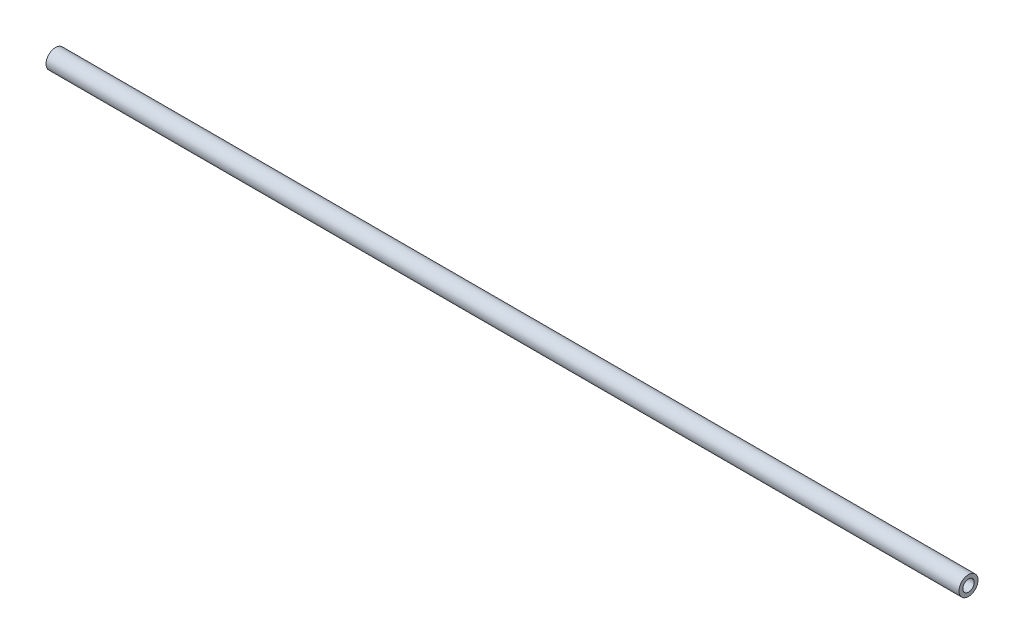
ISO-10303-21;
HEADER;
FILE_DESCRIPTION(('STEP AP214'),'2;1');
FILE_NAME('part.step','',(''),(''),'','','');
FILE_SCHEMA(('AUTOMOTIVE_DESIGN { 1 0 10303 214 1 1 1 1 }'));
ENDSEC;
DATA;
#1=APPLICATION_CONTEXT('core data for automotive mechanical design processes');
#2=APPLICATION_PROTOCOL_DEFINITION('international standard','automotive_design',2000,#1);
#3=PRODUCT_CONTEXT('',#1,'mechanical');
#4=PRODUCT('Part','Part','',(#3));
#5=PRODUCT_RELATED_PRODUCT_CATEGORY('part','',(#4));
#6=PRODUCT_DEFINITION_FORMATION('','',#4);
#7=PRODUCT_DEFINITION_CONTEXT('part definition',#1,'design');
#8=PRODUCT_DEFINITION('design','',#6,#7);
#9=PRODUCT_DEFINITION_SHAPE('','',#8);
#10=(LENGTH_UNIT() NAMED_UNIT(*) SI_UNIT(.MILLI.,.METRE.));
#11=(NAMED_UNIT(*) PLANE_ANGLE_UNIT() SI_UNIT($,.RADIAN.));
#12=(NAMED_UNIT(*) SI_UNIT($,.STERADIAN.) SOLID_ANGLE_UNIT());
#13=UNCERTAINTY_MEASURE_WITH_UNIT(LENGTH_MEASURE(1.E-05),#10,'distance_accuracy_value','');
#14=(GEOMETRIC_REPRESENTATION_CONTEXT(3) GLOBAL_UNCERTAINTY_ASSIGNED_CONTEXT((#13)) GLOBAL_UNIT_ASSIGNED_CONTEXT((#10,
#11,#12)) REPRESENTATION_CONTEXT('',''));
#15=CARTESIAN_POINT('',(0.,0.,0.));
#16=DIRECTION('',(0.,0.,1.));
#17=DIRECTION('',(1.,0.,0.));
#18=AXIS2_PLACEMENT_3D('',#15,#16,#17);
#19=CARTESIAN_POINT('',(152.4,0.,0.));
#20=DIRECTION('',(1.,0.,0.));
#21=DIRECTION('',(0.,0.,-1.));
#22=AXIS2_PLACEMENT_3D('',#19,#20,#21);
#23=PLANE('',#22);
#24=CARTESIAN_POINT('',(152.4,0.,0.));
#25=DIRECTION('',(1.,0.,0.));
#26=DIRECTION('',(0.,0.,-1.));
#27=AXIS2_PLACEMENT_3D('',#24,#25,#26);
#28=CIRCLE('',#27,3.175);
#29=CARTESIAN_POINT('',(152.4,0.,3.175));
#30=VERTEX_POINT('',#29);
#31=EDGE_CURVE('E10',#30,#30,#28,.T.);
#32=ORIENTED_EDGE('',*,*,#31,.T.);
#33=EDGE_LOOP('',(#32));
#34=FACE_BOUND('',#33,.T.);
#35=CARTESIAN_POINT('',(152.4,0.,0.));
#36=DIRECTION('',(1.,0.,0.));
#37=DIRECTION('',(0.,0.,-1.));
#38=AXIS2_PLACEMENT_3D('',#35,#36,#37);
#39=CIRCLE('',#38,1.905);
#40=CARTESIAN_POINT('',(152.4,0.,1.905));
#41=VERTEX_POINT('',#40);
#42=EDGE_CURVE('E41',#41,#41,#39,.T.);
#43=ORIENTED_EDGE('',*,*,#42,.F.);
#44=EDGE_LOOP('',(#43));
#45=FACE_BOUND('',#44,.T.);
#46=ADVANCED_FACE('F30',(#34,#45),#23,.T.);
#47=CARTESIAN_POINT('',(-152.4,0.,0.));
#48=DIRECTION('',(1.,0.,0.));
#49=DIRECTION('',(0.,0.,-1.));
#50=AXIS2_PLACEMENT_3D('',#47,#48,#49);
#51=PLANE('',#50);
#52=CARTESIAN_POINT('',(-152.4,0.,0.));
#53=DIRECTION('',(1.,0.,0.));
#54=DIRECTION('',(0.,0.,-1.));
#55=AXIS2_PLACEMENT_3D('',#52,#53,#54);
#56=CIRCLE('',#55,3.175);
#57=CARTESIAN_POINT('',(-152.4,0.,3.175));
#58=VERTEX_POINT('',#57);
#59=EDGE_CURVE('E34',#58,#58,#56,.T.);
#60=ORIENTED_EDGE('',*,*,#59,.F.);
#61=EDGE_LOOP('',(#60));
#62=FACE_BOUND('',#61,.T.);
#63=CARTESIAN_POINT('',(-152.4,0.,0.));
#64=DIRECTION('',(1.,0.,0.));
#65=DIRECTION('',(0.,0.,-1.));
#66=AXIS2_PLACEMENT_3D('',#63,#64,#65);
#67=CIRCLE('',#66,1.905);
#68=CARTESIAN_POINT('',(-152.4,0.,1.905));
#69=VERTEX_POINT('',#68);
#70=EDGE_CURVE('E43',#69,#69,#67,.T.);
#71=ORIENTED_EDGE('',*,*,#70,.T.);
#72=EDGE_LOOP('',(#71));
#73=FACE_BOUND('',#72,.T.);
#74=ADVANCED_FACE('F53',(#62,#73),#51,.F.);
#75=CARTESIAN_POINT('',(152.4,0.,0.));
#76=DIRECTION('',(-1.,0.,0.));
#77=DIRECTION('',(0.,0.,1.));
#78=AXIS2_PLACEMENT_3D('',#75,#76,#77);
#79=CYLINDRICAL_SURFACE('',#78,3.175);
#80=CARTESIAN_POINT('',(152.4,0.,3.175));
#81=CARTESIAN_POINT('',(149.225,0.,3.175));
#82=CARTESIAN_POINT('',(146.05,0.,3.175));
#83=CARTESIAN_POINT('',(139.7,0.,3.175));
#84=CARTESIAN_POINT('',(136.525,0.,3.175));
#85=CARTESIAN_POINT('',(130.175,0.,3.175));
#86=CARTESIAN_POINT('',(127.,0.,3.175));
#87=CARTESIAN_POINT('',(120.65,0.,3.175));
#88=CARTESIAN_POINT('',(117.475,0.,3.175));
#89=CARTESIAN_POINT('',(111.125,0.,3.175));
#90=CARTESIAN_POINT('',(107.95,0.,3.175));
#91=CARTESIAN_POINT('',(101.6,0.,3.175));
#92=CARTESIAN_POINT('',(98.425,0.,3.175));
#93=CARTESIAN_POINT('',(92.075,0.,3.175));
#94=CARTESIAN_POINT('',(88.9,0.,3.175));
#95=CARTESIAN_POINT('',(82.55,0.,3.175));
#96=CARTESIAN_POINT('',(79.375,0.,3.175));
#97=CARTESIAN_POINT('',(73.025,0.,3.175));
#98=CARTESIAN_POINT('',(69.85,0.,3.175));
#99=CARTESIAN_POINT('',(63.5,0.,3.175));
#100=CARTESIAN_POINT('',(60.325,0.,3.175));
#101=CARTESIAN_POINT('',(53.975,0.,3.175));
#102=CARTESIAN_POINT('',(50.8,0.,3.175));
#103=CARTESIAN_POINT('',(44.45,0.,3.175));
#104=CARTESIAN_POINT('',(41.275,0.,3.175));
#105=CARTESIAN_POINT('',(34.925,0.,3.175));
#106=CARTESIAN_POINT('',(31.75,0.,3.175));
#107=CARTESIAN_POINT('',(25.4,0.,3.175));
#108=CARTESIAN_POINT('',(22.225,0.,3.175));
#109=CARTESIAN_POINT('',(15.875,0.,3.175));
#110=CARTESIAN_POINT('',(12.7,0.,3.175));
#111=CARTESIAN_POINT('',(6.34999999999998,0.,3.175));
#112=CARTESIAN_POINT('',(3.17499999999997,0.,3.175));
#113=CARTESIAN_POINT('',(-3.17500000000003,0.,3.175));
#114=CARTESIAN_POINT('',(-6.35000000000003,0.,3.175));
#115=CARTESIAN_POINT('',(-12.7,0.,3.175));
#116=CARTESIAN_POINT('',(-15.875,0.,3.175));
#117=CARTESIAN_POINT('',(-22.225,0.,3.175));
#118=CARTESIAN_POINT('',(-25.4,0.,3.175));
#119=CARTESIAN_POINT('',(-31.75,0.,3.175));
#120=CARTESIAN_POINT('',(-34.925,0.,3.175));
#121=CARTESIAN_POINT('',(-41.275,0.,3.175));
#122=CARTESIAN_POINT('',(-44.45,0.,3.175));
#123=CARTESIAN_POINT('',(-50.8,0.,3.175));
#124=CARTESIAN_POINT('',(-53.975,0.,3.175));
#125=CARTESIAN_POINT('',(-60.325,0.,3.175));
#126=CARTESIAN_POINT('',(-63.5,0.,3.175));
#127=CARTESIAN_POINT('',(-69.85,0.,3.175));
#128=CARTESIAN_POINT('',(-73.025,0.,3.175));
#129=CARTESIAN_POINT('',(-79.375,0.,3.175));
#130=CARTESIAN_POINT('',(-82.5500000000001,0.,3.175));
#131=CARTESIAN_POINT('',(-88.9,0.,3.175));
#132=CARTESIAN_POINT('',(-92.0750000000001,0.,3.175));
#133=CARTESIAN_POINT('',(-98.425,0.,3.175));
#134=CARTESIAN_POINT('',(-101.6,0.,3.175));
#135=CARTESIAN_POINT('',(-107.95,0.,3.175));
#136=CARTESIAN_POINT('',(-111.125,0.,3.175));
#137=CARTESIAN_POINT('',(-117.475,0.,3.175));
#138=CARTESIAN_POINT('',(-120.65,0.,3.175));
#139=CARTESIAN_POINT('',(-127.,0.,3.175));
#140=CARTESIAN_POINT('',(-130.175,0.,3.175));
#141=CARTESIAN_POINT('',(-136.525,0.,3.175));
#142=CARTESIAN_POINT('',(-139.7,0.,3.175));
#143=CARTESIAN_POINT('',(-146.05,0.,3.175));
#144=CARTESIAN_POINT('',(-149.225,0.,3.175));
#145=CARTESIAN_POINT('',(-152.4,0.,3.175));
#146=B_SPLINE_CURVE_WITH_KNOTS('',3,(#80,#81,#82,#83,#84,#85,#86,#87,#88,#89,#90,#91,#92,#93,
#94,#95,#96,#97,#98,#99,#100,#101,#102,#103,#104,#105,#106,#107,#108,#109,#110,#111,#112,#113,
#114,#115,#116,#117,#118,#119,#120,#121,#122,#123,#124,#125,#126,#127,#128,#129,#130,#131,#132,
#133,#134,#135,#136,#137,#138,#139,#140,#141,#142,#143,#144,#145),.UNSPECIFIED.,.F.,.F.,(4,2,2,
2,2,2,2,2,2,2,2,2,2,2,2,2,2,2,2,2,2,2,2,2,2,2,2,2,2,2,2,2,4),(0.,9.52499999999998,19.05,28.575,
38.1,47.625,57.15,66.675,76.2,85.725,95.25,104.775,114.3,123.825,133.35,142.875,152.4,161.925,
171.45,180.975,190.5,200.025,209.55,219.075,228.6,238.125,247.65,257.175,266.7,276.225,285.75,
295.275,304.8),.UNSPECIFIED.);
#147=EDGE_CURVE('BSEAM32',#30,#58,#146,.T.);
#148=ORIENTED_EDGE('',*,*,#31,.F.);
#149=ORIENTED_EDGE('',*,*,#59,.T.);
#150=ORIENTED_EDGE('',*,*,#147,.T.);
#151=ORIENTED_EDGE('',*,*,#147,.F.);
#152=EDGE_LOOP('',(#148,#150,#149,#151));
#153=FACE_BOUND('',#152,.T.);
#154=ADVANCED_FACE('F32',(#153),#79,.T.);
#155=CARTESIAN_POINT('',(152.4,0.,0.));
#156=DIRECTION('',(-1.,0.,0.));
#157=DIRECTION('',(0.,0.,1.));
#158=AXIS2_PLACEMENT_3D('',#155,#156,#157);
#159=CYLINDRICAL_SURFACE('',#158,1.905);
#160=CARTESIAN_POINT('',(152.4,0.,1.905));
#161=CARTESIAN_POINT('',(149.225,0.,1.905));
#162=CARTESIAN_POINT('',(146.05,0.,1.905));
#163=CARTESIAN_POINT('',(139.7,0.,1.905));
#164=CARTESIAN_POINT('',(136.525,0.,1.905));
#165=CARTESIAN_POINT('',(130.175,0.,1.905));
#166=CARTESIAN_POINT('',(127.,0.,1.905));
#167=CARTESIAN_POINT('',(120.65,0.,1.905));
#168=CARTESIAN_POINT('',(117.475,0.,1.905));
#169=CARTESIAN_POINT('',(111.125,0.,1.905));
#170=CARTESIAN_POINT('',(107.95,0.,1.905));
#171=CARTESIAN_POINT('',(101.6,0.,1.905));
#172=CARTESIAN_POINT('',(98.425,0.,1.905));
#173=CARTESIAN_POINT('',(92.075,0.,1.905));
#174=CARTESIAN_POINT('',(88.9,0.,1.905));
#175=CARTESIAN_POINT('',(82.55,0.,1.905));
#176=CARTESIAN_POINT('',(79.375,0.,1.905));
#177=CARTESIAN_POINT('',(73.025,0.,1.905));
#178=CARTESIAN_POINT('',(69.85,0.,1.905));
#179=CARTESIAN_POINT('',(63.5,0.,1.905));
#180=CARTESIAN_POINT('',(60.325,0.,1.905));
#181=CARTESIAN_POINT('',(53.975,0.,1.905));
#182=CARTESIAN_POINT('',(50.8,0.,1.905));
#183=CARTESIAN_POINT('',(44.45,0.,1.905));
#184=CARTESIAN_POINT('',(41.275,0.,1.905));
#185=CARTESIAN_POINT('',(34.925,0.,1.905));
#186=CARTESIAN_POINT('',(31.75,0.,1.905));
#187=CARTESIAN_POINT('',(25.4,0.,1.905));
#188=CARTESIAN_POINT('',(22.225,0.,1.905));
#189=CARTESIAN_POINT('',(15.875,0.,1.905));
#190=CARTESIAN_POINT('',(12.7,0.,1.905));
#191=CARTESIAN_POINT('',(6.34999999999998,0.,1.905));
#192=CARTESIAN_POINT('',(3.17499999999997,0.,1.905));
#193=CARTESIAN_POINT('',(-3.17500000000003,0.,1.905));
#194=CARTESIAN_POINT('',(-6.35000000000003,0.,1.905));
#195=CARTESIAN_POINT('',(-12.7,0.,1.905));
#196=CARTESIAN_POINT('',(-15.875,0.,1.905));
#197=CARTESIAN_POINT('',(-22.225,0.,1.905));
#198=CARTESIAN_POINT('',(-25.4,0.,1.905));
#199=CARTESIAN_POINT('',(-31.75,0.,1.905));
#200=CARTESIAN_POINT('',(-34.925,0.,1.905));
#201=CARTESIAN_POINT('',(-41.275,0.,1.905));
#202=CARTESIAN_POINT('',(-44.45,0.,1.905));
#203=CARTESIAN_POINT('',(-50.8,0.,1.905));
#204=CARTESIAN_POINT('',(-53.975,0.,1.905));
#205=CARTESIAN_POINT('',(-60.325,0.,1.905));
#206=CARTESIAN_POINT('',(-63.5,0.,1.905));
#207=CARTESIAN_POINT('',(-69.85,0.,1.905));
#208=CARTESIAN_POINT('',(-73.025,0.,1.905));
#209=CARTESIAN_POINT('',(-79.375,0.,1.905));
#210=CARTESIAN_POINT('',(-82.5500000000001,0.,1.905));
#211=CARTESIAN_POINT('',(-88.9,0.,1.905));
#212=CARTESIAN_POINT('',(-92.0750000000001,0.,1.905));
#213=CARTESIAN_POINT('',(-98.425,0.,1.905));
#214=CARTESIAN_POINT('',(-101.6,0.,1.905));
#215=CARTESIAN_POINT('',(-107.95,0.,1.905));
#216=CARTESIAN_POINT('',(-111.125,0.,1.905));
#217=CARTESIAN_POINT('',(-117.475,0.,1.905));
#218=CARTESIAN_POINT('',(-120.65,0.,1.905));
#219=CARTESIAN_POINT('',(-127.,0.,1.905));
#220=CARTESIAN_POINT('',(-130.175,0.,1.905));
#221=CARTESIAN_POINT('',(-136.525,0.,1.905));
#222=CARTESIAN_POINT('',(-139.7,0.,1.905));
#223=CARTESIAN_POINT('',(-146.05,0.,1.905));
#224=CARTESIAN_POINT('',(-149.225,0.,1.905));
#225=CARTESIAN_POINT('',(-152.4,0.,1.905));
#226=B_SPLINE_CURVE_WITH_KNOTS('',3,(#160,#161,#162,#163,#164,#165,#166,#167,#168,#169,#170,
#171,#172,#173,#174,#175,#176,#177,#178,#179,#180,#181,#182,#183,#184,#185,#186,#187,#188,#189,
#190,#191,#192,#193,#194,#195,#196,#197,#198,#199,#200,#201,#202,#203,#204,#205,#206,#207,#208,
#209,#210,#211,#212,#213,#214,#215,#216,#217,#218,#219,#220,#221,#222,#223,#224,#225),
.UNSPECIFIED.,.F.,.F.,(4,2,2,2,2,2,2,2,2,2,2,2,2,2,2,2,2,2,2,2,2,2,2,2,2,2,2,2,2,2,2,2,4),(0.,
9.52499999999998,19.05,28.575,38.1,47.625,57.15,66.675,76.2,85.725,95.25,104.775,114.3,123.825,
133.35,142.875,152.4,161.925,171.45,180.975,190.5,200.025,209.55,219.075,228.6,238.125,247.65,
257.175,266.7,276.225,285.75,295.275,304.8),.UNSPECIFIED.);
#227=EDGE_CURVE('BSEAM49',#41,#69,#226,.T.);
#228=ORIENTED_EDGE('',*,*,#42,.T.);
#229=ORIENTED_EDGE('',*,*,#70,.F.);
#230=ORIENTED_EDGE('',*,*,#227,.T.);
#231=ORIENTED_EDGE('',*,*,#227,.F.);
#232=EDGE_LOOP('',(#228,#230,#229,#231));
#233=FACE_BOUND('',#232,.T.);
#234=ADVANCED_FACE('F49',(#233),#159,.F.);
#235=CLOSED_SHELL('',(#46,#74,#154,#234));
#236=MANIFOLD_SOLID_BREP('B2',#235);
#237=ADVANCED_BREP_SHAPE_REPRESENTATION('',(#18,#236),#14);
#238=SHAPE_DEFINITION_REPRESENTATION(#9,#237);
ENDSEC;
END-ISO-10303-21;
